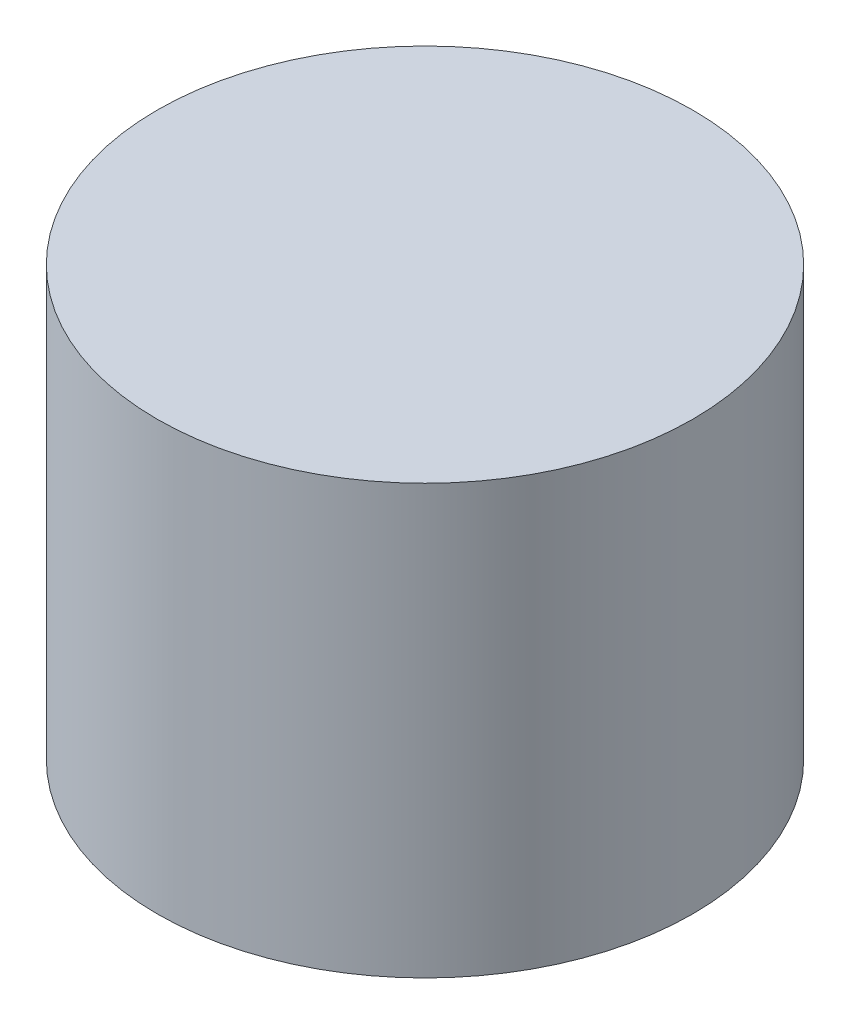
ISO-10303-21;
HEADER;
FILE_DESCRIPTION(('STEP AP214'),'2;1');
FILE_NAME('part.step','',(''),(''),'','','');
FILE_SCHEMA(('AUTOMOTIVE_DESIGN { 1 0 10303 214 1 1 1 1 }'));
ENDSEC;
DATA;
#1=APPLICATION_CONTEXT('core data for automotive mechanical design processes');
#2=APPLICATION_PROTOCOL_DEFINITION('international standard','automotive_design',2000,#1);
#3=PRODUCT_CONTEXT('',#1,'mechanical');
#4=PRODUCT('Part','Part','',(#3));
#5=PRODUCT_RELATED_PRODUCT_CATEGORY('part','',(#4));
#6=PRODUCT_DEFINITION_FORMATION('','',#4);
#7=PRODUCT_DEFINITION_CONTEXT('part definition',#1,'design');
#8=PRODUCT_DEFINITION('design','',#6,#7);
#9=PRODUCT_DEFINITION_SHAPE('','',#8);
#10=(LENGTH_UNIT() NAMED_UNIT(*) SI_UNIT(.MILLI.,.METRE.));
#11=(NAMED_UNIT(*) PLANE_ANGLE_UNIT() SI_UNIT($,.RADIAN.));
#12=(NAMED_UNIT(*) SI_UNIT($,.STERADIAN.) SOLID_ANGLE_UNIT());
#13=UNCERTAINTY_MEASURE_WITH_UNIT(LENGTH_MEASURE(1.E-05),#10,'distance_accuracy_value','');
#14=(GEOMETRIC_REPRESENTATION_CONTEXT(3) GLOBAL_UNCERTAINTY_ASSIGNED_CONTEXT((#13)) GLOBAL_UNIT_ASSIGNED_CONTEXT((#10,
#11,#12)) REPRESENTATION_CONTEXT('',''));
#15=CARTESIAN_POINT('',(0.,0.,0.));
#16=DIRECTION('',(0.,0.,1.));
#17=DIRECTION('',(1.,0.,0.));
#18=AXIS2_PLACEMENT_3D('',#15,#16,#17);
#19=CARTESIAN_POINT('',(0.,101.6,0.));
#20=DIRECTION('',(0.,-1.,0.));
#21=DIRECTION('',(0.,0.,-1.));
#22=AXIS2_PLACEMENT_3D('',#19,#20,#21);
#23=CYLINDRICAL_SURFACE('',#22,63.5);
#24=CARTESIAN_POINT('',(0.,101.6,0.));
#25=DIRECTION('',(0.,1.,0.));
#26=DIRECTION('',(0.,0.,1.));
#27=AXIS2_PLACEMENT_3D('',#24,#25,#26);
#28=CIRCLE('',#27,63.5);
#29=CARTESIAN_POINT('',(0.,101.6,63.5));
#30=VERTEX_POINT('',#29);
#31=EDGE_CURVE('E10',#30,#30,#28,.T.);
#32=ORIENTED_EDGE('',*,*,#31,.F.);
#33=EDGE_LOOP('',(#32));
#34=FACE_BOUND('',#33,.T.);
#35=CARTESIAN_POINT('',(0.,0.,0.));
#36=DIRECTION('',(0.,1.,0.));
#37=DIRECTION('',(0.,0.,1.));
#38=AXIS2_PLACEMENT_3D('',#35,#36,#37);
#39=CIRCLE('',#38,63.5);
#40=CARTESIAN_POINT('',(0.,0.,63.5));
#41=VERTEX_POINT('',#40);
#42=EDGE_CURVE('E44',#41,#41,#39,.T.);
#43=ORIENTED_EDGE('',*,*,#42,.T.);
#44=EDGE_LOOP('',(#43));
#45=FACE_BOUND('',#44,.T.);
#46=ADVANCED_FACE('F41',(#34,#45),#23,.T.);
#47=CARTESIAN_POINT('',(0.,101.6,0.));
#48=DIRECTION('',(0.,1.,0.));
#49=DIRECTION('',(0.,0.,1.));
#50=AXIS2_PLACEMENT_3D('',#47,#48,#49);
#51=PLANE('',#50);
#52=ORIENTED_EDGE('',*,*,#31,.T.);
#53=EDGE_LOOP('',(#52));
#54=FACE_BOUND('',#53,.T.);
#55=ADVANCED_FACE('F56',(#54),#51,.T.);
#56=CARTESIAN_POINT('',(0.,0.,0.));
#57=DIRECTION('',(0.,1.,0.));
#58=DIRECTION('',(0.,0.,1.));
#59=AXIS2_PLACEMENT_3D('',#56,#57,#58);
#60=PLANE('',#59);
#61=ORIENTED_EDGE('',*,*,#42,.F.);
#62=EDGE_LOOP('',(#61));
#63=FACE_BOUND('',#62,.T.);
#64=ADVANCED_FACE('F54',(#63),#60,.F.);
#65=CLOSED_SHELL('',(#46,#55,#64));
#66=MANIFOLD_SOLID_BREP('B2',#65);
#67=ADVANCED_BREP_SHAPE_REPRESENTATION('',(#18,#66),#14);
#68=SHAPE_DEFINITION_REPRESENTATION(#9,#67);
ENDSEC;
END-ISO-10303-21;
